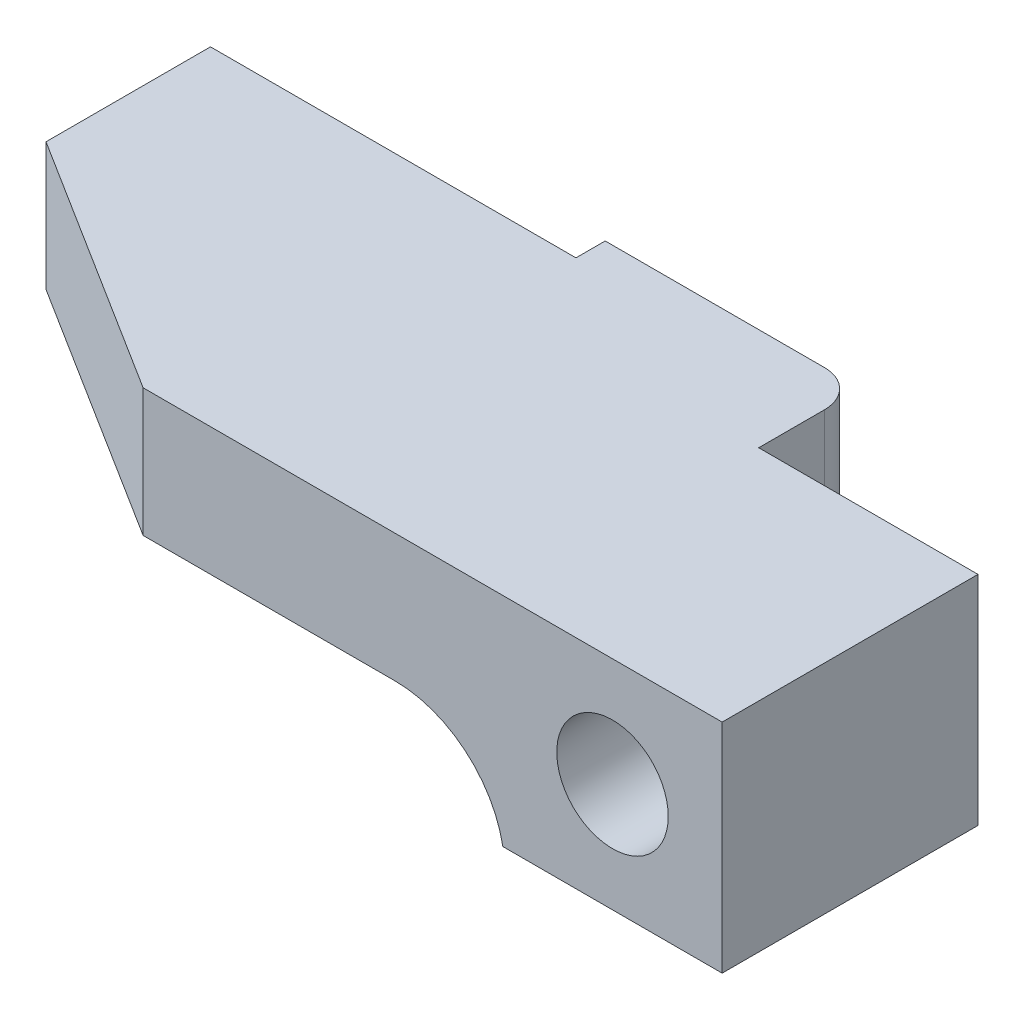
ISO-10303-21;
HEADER;
FILE_DESCRIPTION(('STEP AP214'),'2;1');
FILE_NAME('part.step','',(''),(''),'','','');
FILE_SCHEMA(('AUTOMOTIVE_DESIGN { 1 0 10303 214 1 1 1 1 }'));
ENDSEC;
DATA;
#1=APPLICATION_CONTEXT('core data for automotive mechanical design processes');
#2=APPLICATION_PROTOCOL_DEFINITION('international standard','automotive_design',2000,#1);
#3=PRODUCT_CONTEXT('',#1,'mechanical');
#4=PRODUCT('Part','Part','',(#3));
#5=PRODUCT_RELATED_PRODUCT_CATEGORY('part','',(#4));
#6=PRODUCT_DEFINITION_FORMATION('','',#4);
#7=PRODUCT_DEFINITION_CONTEXT('part definition',#1,'design');
#8=PRODUCT_DEFINITION('design','',#6,#7);
#9=PRODUCT_DEFINITION_SHAPE('','',#8);
#10=(LENGTH_UNIT() NAMED_UNIT(*) SI_UNIT(.MILLI.,.METRE.));
#11=(NAMED_UNIT(*) PLANE_ANGLE_UNIT() SI_UNIT($,.RADIAN.));
#12=(NAMED_UNIT(*) SI_UNIT($,.STERADIAN.) SOLID_ANGLE_UNIT());
#13=UNCERTAINTY_MEASURE_WITH_UNIT(LENGTH_MEASURE(1.E-05),#10,'distance_accuracy_value','');
#14=(GEOMETRIC_REPRESENTATION_CONTEXT(3) GLOBAL_UNCERTAINTY_ASSIGNED_CONTEXT((#13)) GLOBAL_UNIT_ASSIGNED_CONTEXT((#10,
#11,#12)) REPRESENTATION_CONTEXT('',''));
#15=CARTESIAN_POINT('',(0.,0.,0.));
#16=DIRECTION('',(0.,0.,1.));
#17=DIRECTION('',(1.,0.,0.));
#18=AXIS2_PLACEMENT_3D('',#15,#16,#17);
#19=CARTESIAN_POINT('',(0.,3.5,0.));
#20=DIRECTION('',(-1.,0.,0.));
#21=DIRECTION('',(0.,0.,1.));
#22=AXIS2_PLACEMENT_3D('',#19,#20,#21);
#23=PLANE('',#22);
#24=DIRECTION('',(0.,-1.,0.));
#25=VECTOR('',#24,1.);
#26=CARTESIAN_POINT('',(0.,3.5,-7.));
#27=LINE('',#26,#25);
#28=CARTESIAN_POINT('',(0.,3.5,-7.));
#29=VERTEX_POINT('',#28);
#30=CARTESIAN_POINT('',(0.,-2.45,-7.));
#31=VERTEX_POINT('',#30);
#32=EDGE_CURVE('E128',#29,#31,#27,.T.);
#33=ORIENTED_EDGE('',*,*,#32,.F.);
#34=DIRECTION('',(0.,0.,-1.));
#35=VECTOR('',#34,1.);
#36=CARTESIAN_POINT('',(0.,3.5,0.));
#37=LINE('',#36,#35);
#38=CARTESIAN_POINT('',(0.,3.5,0.));
#39=VERTEX_POINT('',#38);
#40=EDGE_CURVE('E201',#39,#29,#37,.T.);
#41=ORIENTED_EDGE('',*,*,#40,.F.);
#42=DIRECTION('',(0.,-1.,0.));
#43=VECTOR('',#42,1.);
#44=CARTESIAN_POINT('',(0.,3.5,0.));
#45=LINE('',#44,#43);
#46=CARTESIAN_POINT('',(0.,-2.45,0.));
#47=VERTEX_POINT('',#46);
#48=EDGE_CURVE('E194',#39,#47,#45,.T.);
#49=ORIENTED_EDGE('',*,*,#48,.T.);
#50=DIRECTION('',(0.,0.,-1.));
#51=VECTOR('',#50,1.);
#52=CARTESIAN_POINT('',(0.,-2.45,0.));
#53=LINE('',#52,#51);
#54=EDGE_CURVE('E144',#47,#31,#53,.T.);
#55=ORIENTED_EDGE('',*,*,#54,.T.);
#56=EDGE_LOOP('',(#33,#41,#49,#55));
#57=FACE_BOUND('',#56,.T.);
#58=ADVANCED_FACE('F39',(#57),#23,.F.);
#59=CARTESIAN_POINT('',(0.,3.5,0.));
#60=DIRECTION('',(0.,1.,0.));
#61=DIRECTION('',(0.,0.,1.));
#62=AXIS2_PLACEMENT_3D('',#59,#60,#61);
#63=PLANE('',#62);
#64=DIRECTION('',(0.,0.,-1.));
#65=VECTOR('',#64,1.);
#66=CARTESIAN_POINT('',(-6.,3.5,-9.8));
#67=LINE('',#66,#65);
#68=CARTESIAN_POINT('',(-6.,3.5,-7.));
#69=VERTEX_POINT('',#68);
#70=CARTESIAN_POINT('',(-6.,3.5,-8.8));
#71=VERTEX_POINT('',#70);
#72=EDGE_CURVE('E239',#69,#71,#67,.T.);
#73=ORIENTED_EDGE('',*,*,#72,.T.);
#74=CARTESIAN_POINT('',(-7.,3.5,-8.8));
#75=DIRECTION('',(0.,1.,0.));
#76=DIRECTION('',(0.,0.,1.));
#77=AXIS2_PLACEMENT_3D('',#74,#75,#76);
#78=CIRCLE('',#77,1.);
#79=CARTESIAN_POINT('',(-7.,3.5,-9.8));
#80=VERTEX_POINT('',#79);
#81=EDGE_CURVE('E155',#71,#80,#78,.T.);
#82=ORIENTED_EDGE('',*,*,#81,.T.);
#83=DIRECTION('',(-1.,0.,0.));
#84=VECTOR('',#83,1.);
#85=CARTESIAN_POINT('',(-13.,3.5,-9.8));
#86=LINE('',#85,#84);
#87=CARTESIAN_POINT('',(-13.,3.5,-9.8));
#88=VERTEX_POINT('',#87);
#89=EDGE_CURVE('E236',#80,#88,#86,.T.);
#90=ORIENTED_EDGE('',*,*,#89,.T.);
#91=DIRECTION('',(0.,0.,1.));
#92=VECTOR('',#91,1.);
#93=CARTESIAN_POINT('',(-13.,3.5,-9.));
#94=LINE('',#93,#92);
#95=CARTESIAN_POINT('',(-13.,3.5,-9.));
#96=VERTEX_POINT('',#95);
#97=EDGE_CURVE('E233',#88,#96,#94,.T.);
#98=ORIENTED_EDGE('',*,*,#97,.T.);
#99=DIRECTION('',(-1.,0.,0.));
#100=VECTOR('',#99,1.);
#101=CARTESIAN_POINT('',(-13.,3.5,-9.));
#102=LINE('',#101,#100);
#103=CARTESIAN_POINT('',(-23.,3.5,-9.));
#104=VERTEX_POINT('',#103);
#105=EDGE_CURVE('E230',#96,#104,#102,.T.);
#106=ORIENTED_EDGE('',*,*,#105,.T.);
#107=DIRECTION('',(0.,0.,1.));
#108=VECTOR('',#107,1.);
#109=CARTESIAN_POINT('',(-23.,3.5,-9.));
#110=LINE('',#109,#108);
#111=CARTESIAN_POINT('',(-23.,3.5,-4.5));
#112=VERTEX_POINT('',#111);
#113=EDGE_CURVE('E227',#104,#112,#110,.T.);
#114=ORIENTED_EDGE('',*,*,#113,.T.);
#115=DIRECTION('',(0.846578536173501,0.,0.532263827523844));
#116=VECTOR('',#115,1.);
#117=CARTESIAN_POINT('',(-15.8426407811639,3.5,0.));
#118=LINE('',#117,#116);
#119=CARTESIAN_POINT('',(-15.8426407811639,3.5,0.));
#120=VERTEX_POINT('',#119);
#121=EDGE_CURVE('E224',#112,#120,#118,.T.);
#122=ORIENTED_EDGE('',*,*,#121,.T.);
#123=DIRECTION('',(1.,0.,0.));
#124=VECTOR('',#123,1.);
#125=CARTESIAN_POINT('',(-15.8426407811639,3.5,0.));
#126=LINE('',#125,#124);
#127=EDGE_CURVE('E197',#120,#39,#126,.T.);
#128=ORIENTED_EDGE('',*,*,#127,.T.);
#129=ORIENTED_EDGE('',*,*,#40,.T.);
#130=DIRECTION('',(1.,0.,0.));
#131=VECTOR('',#130,1.);
#132=CARTESIAN_POINT('',(0.,3.5,-7.));
#133=LINE('',#132,#131);
#134=EDGE_CURVE('E133',#69,#29,#133,.T.);
#135=ORIENTED_EDGE('',*,*,#134,.F.);
#136=EDGE_LOOP('',(#73,#82,#90,#98,#106,#114,#122,#128,#129,#135));
#137=FACE_BOUND('',#136,.T.);
#138=ADVANCED_FACE('F303',(#137),#63,.T.);
#139=CARTESIAN_POINT('',(0.,-2.45,0.));
#140=DIRECTION('',(0.,1.,0.));
#141=DIRECTION('',(0.,0.,1.));
#142=AXIS2_PLACEMENT_3D('',#139,#140,#141);
#143=PLANE('',#142);
#144=DIRECTION('',(1.,0.,0.));
#145=VECTOR('',#144,1.);
#146=CARTESIAN_POINT('',(0.,-2.45,-7.));
#147=LINE('',#146,#145);
#148=CARTESIAN_POINT('',(-6.,-2.45,-7.));
#149=VERTEX_POINT('',#148);
#150=EDGE_CURVE('E124',#149,#31,#147,.T.);
#151=ORIENTED_EDGE('',*,*,#150,.T.);
#152=ORIENTED_EDGE('',*,*,#54,.F.);
#153=DIRECTION('',(1.,0.,0.));
#154=VECTOR('',#153,1.);
#155=CARTESIAN_POINT('',(-6.,-2.45,0.));
#156=LINE('',#155,#154);
#157=CARTESIAN_POINT('',(-6.,-2.45,0.));
#158=VERTEX_POINT('',#157);
#159=EDGE_CURVE('E141',#158,#47,#156,.T.);
#160=ORIENTED_EDGE('',*,*,#159,.F.);
#161=DIRECTION('',(0.,0.,1.));
#162=VECTOR('',#161,1.);
#163=CARTESIAN_POINT('',(-6.,-2.45,-9.));
#164=LINE('',#163,#162);
#165=EDGE_CURVE('E138',#149,#158,#164,.T.);
#166=ORIENTED_EDGE('',*,*,#165,.F.);
#167=EDGE_LOOP('',(#151,#152,#160,#166));
#168=FACE_BOUND('',#167,.T.);
#169=ADVANCED_FACE('F139',(#168),#143,.F.);
#170=CARTESIAN_POINT('',(-6.,3.5,-9.8));
#171=DIRECTION('',(-1.,0.,0.));
#172=DIRECTION('',(0.,0.,1.));
#173=AXIS2_PLACEMENT_3D('',#170,#171,#172);
#174=PLANE('',#173);
#175=DIRECTION('',(0.,0.,-1.));
#176=VECTOR('',#175,1.);
#177=CARTESIAN_POINT('',(-6.,0.,-9.8));
#178=LINE('',#177,#176);
#179=CARTESIAN_POINT('',(-6.,0.,-7.));
#180=VERTEX_POINT('',#179);
#181=CARTESIAN_POINT('',(-6.,0.,-8.8));
#182=VERTEX_POINT('',#181);
#183=EDGE_CURVE('E218',#180,#182,#178,.T.);
#184=ORIENTED_EDGE('',*,*,#183,.T.);
#185=DIRECTION('',(0.,-1.,0.));
#186=VECTOR('',#185,1.);
#187=CARTESIAN_POINT('',(-6.,3.5,-8.8));
#188=LINE('',#187,#186);
#189=EDGE_CURVE('E160',#182,#71,#188,.F.);
#190=ORIENTED_EDGE('',*,*,#189,.T.);
#191=ORIENTED_EDGE('',*,*,#72,.F.);
#192=DIRECTION('',(0.,-1.,0.));
#193=VECTOR('',#192,1.);
#194=CARTESIAN_POINT('',(-6.,3.5,-7.));
#195=LINE('',#194,#193);
#196=EDGE_CURVE('E250',#69,#180,#195,.T.);
#197=ORIENTED_EDGE('',*,*,#196,.T.);
#198=EDGE_LOOP('',(#184,#190,#191,#197));
#199=FACE_BOUND('',#198,.T.);
#200=ADVANCED_FACE('F299',(#199),#174,.F.);
#201=CARTESIAN_POINT('',(-13.,3.5,-9.8));
#202=DIRECTION('',(0.,0.,1.));
#203=DIRECTION('',(1.,0.,0.));
#204=AXIS2_PLACEMENT_3D('',#201,#202,#203);
#205=PLANE('',#204);
#206=ORIENTED_EDGE('',*,*,#89,.F.);
#207=DIRECTION('',(0.,-1.,0.));
#208=VECTOR('',#207,1.);
#209=CARTESIAN_POINT('',(-7.,3.5,-9.8));
#210=LINE('',#209,#208);
#211=CARTESIAN_POINT('',(-7.,0.,-9.8));
#212=VERTEX_POINT('',#211);
#213=EDGE_CURVE('E166',#80,#212,#210,.T.);
#214=ORIENTED_EDGE('',*,*,#213,.T.);
#215=DIRECTION('',(-1.,0.,0.));
#216=VECTOR('',#215,1.);
#217=CARTESIAN_POINT('',(-13.,0.,-9.8));
#218=LINE('',#217,#216);
#219=CARTESIAN_POINT('',(-13.,0.,-9.8));
#220=VERTEX_POINT('',#219);
#221=EDGE_CURVE('E215',#212,#220,#218,.T.);
#222=ORIENTED_EDGE('',*,*,#221,.T.);
#223=DIRECTION('',(0.,-1.,0.));
#224=VECTOR('',#223,1.);
#225=CARTESIAN_POINT('',(-13.,3.5,-9.8));
#226=LINE('',#225,#224);
#227=EDGE_CURVE('E170',#88,#220,#226,.T.);
#228=ORIENTED_EDGE('',*,*,#227,.F.);
#229=EDGE_LOOP('',(#206,#214,#222,#228));
#230=FACE_BOUND('',#229,.T.);
#231=ADVANCED_FACE('F294',(#230),#205,.F.);
#232=CARTESIAN_POINT('',(-13.,3.5,-9.));
#233=DIRECTION('',(1.,0.,0.));
#234=DIRECTION('',(0.,0.,-1.));
#235=AXIS2_PLACEMENT_3D('',#232,#233,#234);
#236=PLANE('',#235);
#237=DIRECTION('',(0.,0.,1.));
#238=VECTOR('',#237,1.);
#239=CARTESIAN_POINT('',(-13.,0.,-9.));
#240=LINE('',#239,#238);
#241=CARTESIAN_POINT('',(-13.,0.,-9.));
#242=VERTEX_POINT('',#241);
#243=EDGE_CURVE('E212',#220,#242,#240,.T.);
#244=ORIENTED_EDGE('',*,*,#243,.T.);
#245=DIRECTION('',(0.,-1.,0.));
#246=VECTOR('',#245,1.);
#247=CARTESIAN_POINT('',(-13.,3.5,-9.));
#248=LINE('',#247,#246);
#249=EDGE_CURVE('E178',#96,#242,#248,.T.);
#250=ORIENTED_EDGE('',*,*,#249,.F.);
#251=ORIENTED_EDGE('',*,*,#97,.F.);
#252=ORIENTED_EDGE('',*,*,#227,.T.);
#253=EDGE_LOOP('',(#244,#250,#251,#252));
#254=FACE_BOUND('',#253,.T.);
#255=ADVANCED_FACE('F290',(#254),#236,.F.);
#256=CARTESIAN_POINT('',(-13.,3.5,-9.));
#257=DIRECTION('',(0.,0.,1.));
#258=DIRECTION('',(1.,0.,0.));
#259=AXIS2_PLACEMENT_3D('',#256,#257,#258);
#260=PLANE('',#259);
#261=DIRECTION('',(-1.,0.,0.));
#262=VECTOR('',#261,1.);
#263=CARTESIAN_POINT('',(-13.,0.,-9.));
#264=LINE('',#263,#262);
#265=CARTESIAN_POINT('',(-23.,0.,-9.));
#266=VERTEX_POINT('',#265);
#267=EDGE_CURVE('E209',#242,#266,#264,.T.);
#268=ORIENTED_EDGE('',*,*,#267,.T.);
#269=DIRECTION('',(0.,-1.,0.));
#270=VECTOR('',#269,1.);
#271=CARTESIAN_POINT('',(-23.,3.5,-9.));
#272=LINE('',#271,#270);
#273=EDGE_CURVE('E182',#104,#266,#272,.T.);
#274=ORIENTED_EDGE('',*,*,#273,.F.);
#275=ORIENTED_EDGE('',*,*,#105,.F.);
#276=ORIENTED_EDGE('',*,*,#249,.T.);
#277=EDGE_LOOP('',(#268,#274,#275,#276));
#278=FACE_BOUND('',#277,.T.);
#279=ADVANCED_FACE('F285',(#278),#260,.F.);
#280=CARTESIAN_POINT('',(-23.,3.5,-9.));
#281=DIRECTION('',(1.,0.,0.));
#282=DIRECTION('',(0.,0.,-1.));
#283=AXIS2_PLACEMENT_3D('',#280,#281,#282);
#284=PLANE('',#283);
#285=DIRECTION('',(0.,0.,1.));
#286=VECTOR('',#285,1.);
#287=CARTESIAN_POINT('',(-23.,0.,-9.));
#288=LINE('',#287,#286);
#289=CARTESIAN_POINT('',(-23.,0.,-4.5));
#290=VERTEX_POINT('',#289);
#291=EDGE_CURVE('E206',#266,#290,#288,.T.);
#292=ORIENTED_EDGE('',*,*,#291,.T.);
#293=DIRECTION('',(0.,-1.,0.));
#294=VECTOR('',#293,1.);
#295=CARTESIAN_POINT('',(-23.,3.5,-4.5));
#296=LINE('',#295,#294);
#297=EDGE_CURVE('E186',#112,#290,#296,.T.);
#298=ORIENTED_EDGE('',*,*,#297,.F.);
#299=ORIENTED_EDGE('',*,*,#113,.F.);
#300=ORIENTED_EDGE('',*,*,#273,.T.);
#301=EDGE_LOOP('',(#292,#298,#299,#300));
#302=FACE_BOUND('',#301,.T.);
#303=ADVANCED_FACE('F279',(#302),#284,.F.);
#304=CARTESIAN_POINT('',(-15.8426407811639,3.5,0.));
#305=DIRECTION('',(0.532263827523844,0.,-0.846578536173501));
#306=DIRECTION('',(-0.846578536173501,0.,-0.532263827523844));
#307=AXIS2_PLACEMENT_3D('',#304,#305,#306);
#308=PLANE('',#307);
#309=DIRECTION('',(0.846578536173501,0.,0.532263827523844));
#310=VECTOR('',#309,1.);
#311=CARTESIAN_POINT('',(-15.8426407811639,0.,0.));
#312=LINE('',#311,#310);
#313=CARTESIAN_POINT('',(-15.8426407811639,0.,0.));
#314=VERTEX_POINT('',#313);
#315=EDGE_CURVE('E202',#290,#314,#312,.T.);
#316=ORIENTED_EDGE('',*,*,#315,.T.);
#317=DIRECTION('',(0.,-1.,0.));
#318=VECTOR('',#317,1.);
#319=CARTESIAN_POINT('',(-15.8426407811639,3.5,0.));
#320=LINE('',#319,#318);
#321=EDGE_CURVE('E190',#120,#314,#320,.T.);
#322=ORIENTED_EDGE('',*,*,#321,.F.);
#323=ORIENTED_EDGE('',*,*,#121,.F.);
#324=ORIENTED_EDGE('',*,*,#297,.T.);
#325=EDGE_LOOP('',(#316,#322,#323,#324));
#326=FACE_BOUND('',#325,.T.);
#327=ADVANCED_FACE('F268',(#326),#308,.F.);
#328=CARTESIAN_POINT('',(0.,3.5,0.));
#329=DIRECTION('',(0.,0.,-1.));
#330=DIRECTION('',(-1.,0.,0.));
#331=AXIS2_PLACEMENT_3D('',#328,#329,#330);
#332=PLANE('',#331);
#333=CARTESIAN_POINT('',(-3.,0.525,0.));
#334=DIRECTION('',(0.,0.,1.));
#335=DIRECTION('',(1.,0.,0.));
#336=AXIS2_PLACEMENT_3D('',#333,#334,#335);
#337=CIRCLE('',#336,1.525);
#338=CARTESIAN_POINT('',(-1.475,0.525,0.));
#339=VERTEX_POINT('',#338);
#340=EDGE_CURVE('E174',#339,#339,#337,.T.);
#341=ORIENTED_EDGE('',*,*,#340,.F.);
#342=EDGE_LOOP('',(#341));
#343=FACE_BOUND('',#342,.T.);
#344=DIRECTION('',(1.,0.,0.));
#345=VECTOR('',#344,1.);
#346=CARTESIAN_POINT('',(0.,0.,0.));
#347=LINE('',#346,#345);
#348=CARTESIAN_POINT('',(-8.94915242061173,0.,0.));
#349=VERTEX_POINT('',#348);
#350=EDGE_CURVE('E198',#314,#349,#347,.T.);
#351=ORIENTED_EDGE('',*,*,#350,.T.);
#352=CARTESIAN_POINT('',(-8.94915242061173,-3.,0.));
#353=DIRECTION('',(0.,0.,-1.));
#354=DIRECTION('',(-1.,0.,0.));
#355=AXIS2_PLACEMENT_3D('',#352,#353,#354);
#356=CIRCLE('',#355,3.);
#357=EDGE_CURVE('E48',#349,#158,#356,.T.);
#358=ORIENTED_EDGE('',*,*,#357,.T.);
#359=ORIENTED_EDGE('',*,*,#159,.T.);
#360=ORIENTED_EDGE('',*,*,#48,.F.);
#361=ORIENTED_EDGE('',*,*,#127,.F.);
#362=ORIENTED_EDGE('',*,*,#321,.T.);
#363=EDGE_LOOP('',(#351,#358,#359,#360,#361,#362));
#364=FACE_BOUND('',#363,.T.);
#365=ADVANCED_FACE('F264',(#343,#364),#332,.F.);
#366=CARTESIAN_POINT('',(0.,0.,0.));
#367=DIRECTION('',(0.,1.,0.));
#368=DIRECTION('',(0.,0.,1.));
#369=AXIS2_PLACEMENT_3D('',#366,#367,#368);
#370=PLANE('',#369);
#371=DIRECTION('',(-1.,0.,0.));
#372=VECTOR('',#371,1.);
#373=CARTESIAN_POINT('',(0.,0.,-7.));
#374=LINE('',#373,#372);
#375=CARTESIAN_POINT('',(-8.94915242061173,0.,-7.));
#376=VERTEX_POINT('',#375);
#377=EDGE_CURVE('E54',#180,#376,#374,.T.);
#378=ORIENTED_EDGE('',*,*,#377,.T.);
#379=DIRECTION('',(0.,0.,-1.));
#380=VECTOR('',#379,1.);
#381=CARTESIAN_POINT('',(-8.94915242061173,0.,0.));
#382=LINE('',#381,#380);
#383=EDGE_CURVE('E148',#376,#349,#382,.F.);
#384=ORIENTED_EDGE('',*,*,#383,.T.);
#385=ORIENTED_EDGE('',*,*,#350,.F.);
#386=ORIENTED_EDGE('',*,*,#315,.F.);
#387=ORIENTED_EDGE('',*,*,#291,.F.);
#388=ORIENTED_EDGE('',*,*,#267,.F.);
#389=ORIENTED_EDGE('',*,*,#243,.F.);
#390=ORIENTED_EDGE('',*,*,#221,.F.);
#391=CARTESIAN_POINT('',(-7.,0.,-8.8));
#392=DIRECTION('',(0.,1.,0.));
#393=DIRECTION('',(0.,0.,1.));
#394=AXIS2_PLACEMENT_3D('',#391,#392,#393);
#395=CIRCLE('',#394,1.);
#396=EDGE_CURVE('E163',#212,#182,#395,.F.);
#397=ORIENTED_EDGE('',*,*,#396,.T.);
#398=ORIENTED_EDGE('',*,*,#183,.F.);
#399=EDGE_LOOP('',(#378,#384,#385,#386,#387,#388,#389,#390,#397,#398));
#400=FACE_BOUND('',#399,.T.);
#401=ADVANCED_FACE('F267',(#400),#370,.F.);
#402=CARTESIAN_POINT('',(0.,3.5,-7.));
#403=DIRECTION('',(0.,0.,-1.));
#404=DIRECTION('',(-1.,0.,0.));
#405=AXIS2_PLACEMENT_3D('',#402,#403,#404);
#406=PLANE('',#405);
#407=CARTESIAN_POINT('',(-3.,0.525,-7.));
#408=DIRECTION('',(0.,0.,-1.));
#409=DIRECTION('',(-1.,0.,0.));
#410=AXIS2_PLACEMENT_3D('',#407,#408,#409);
#411=CIRCLE('',#410,1.525);
#412=CARTESIAN_POINT('',(-4.525,0.525,-7.));
#413=VERTEX_POINT('',#412);
#414=EDGE_CURVE('E134',#413,#413,#411,.T.);
#415=ORIENTED_EDGE('',*,*,#414,.F.);
#416=EDGE_LOOP('',(#415));
#417=FACE_BOUND('',#416,.T.);
#418=ORIENTED_EDGE('',*,*,#196,.F.);
#419=ORIENTED_EDGE('',*,*,#134,.T.);
#420=ORIENTED_EDGE('',*,*,#32,.T.);
#421=ORIENTED_EDGE('',*,*,#150,.F.);
#422=CARTESIAN_POINT('',(-8.94915242061173,-3.,-7.));
#423=DIRECTION('',(0.,0.,-1.));
#424=DIRECTION('',(-1.,0.,0.));
#425=AXIS2_PLACEMENT_3D('',#422,#423,#424);
#426=CIRCLE('',#425,3.);
#427=EDGE_CURVE('E11',#149,#376,#426,.F.);
#428=ORIENTED_EDGE('',*,*,#427,.T.);
#429=ORIENTED_EDGE('',*,*,#377,.F.);
#430=EDGE_LOOP('',(#418,#419,#420,#421,#428,#429));
#431=FACE_BOUND('',#430,.T.);
#432=ADVANCED_FACE('F126',(#417,#431),#406,.T.);
#433=CARTESIAN_POINT('',(-3.,0.525,-9.8));
#434=DIRECTION('',(0.,0.,1.));
#435=DIRECTION('',(1.,0.,0.));
#436=AXIS2_PLACEMENT_3D('',#433,#434,#435);
#437=CYLINDRICAL_SURFACE('',#436,1.525);
#438=ORIENTED_EDGE('',*,*,#414,.T.);
#439=EDGE_LOOP('',(#438));
#440=FACE_BOUND('',#439,.T.);
#441=ORIENTED_EDGE('',*,*,#340,.T.);
#442=EDGE_LOOP('',(#441));
#443=FACE_BOUND('',#442,.T.);
#444=ADVANCED_FACE('F262',(#440,#443),#437,.F.);
#445=CARTESIAN_POINT('',(-7.,3.5,-8.8));
#446=DIRECTION('',(0.,-1.,0.));
#447=DIRECTION('',(0.,0.,-1.));
#448=AXIS2_PLACEMENT_3D('',#445,#446,#447);
#449=CYLINDRICAL_SURFACE('',#448,1.);
#450=ORIENTED_EDGE('',*,*,#81,.F.);
#451=ORIENTED_EDGE('',*,*,#189,.F.);
#452=ORIENTED_EDGE('',*,*,#396,.F.);
#453=ORIENTED_EDGE('',*,*,#213,.F.);
#454=EDGE_LOOP('',(#450,#451,#452,#453));
#455=FACE_BOUND('',#454,.T.);
#456=ADVANCED_FACE('F301',(#455),#449,.T.);
#457=CARTESIAN_POINT('',(-8.94915242061173,-3.,-9.));
#458=DIRECTION('',(0.,0.,-1.));
#459=DIRECTION('',(-1.,0.,0.));
#460=AXIS2_PLACEMENT_3D('',#457,#458,#459);
#461=CYLINDRICAL_SURFACE('',#460,3.);
#462=ORIENTED_EDGE('',*,*,#427,.F.);
#463=ORIENTED_EDGE('',*,*,#165,.T.);
#464=ORIENTED_EDGE('',*,*,#357,.F.);
#465=ORIENTED_EDGE('',*,*,#383,.F.);
#466=EDGE_LOOP('',(#462,#463,#464,#465));
#467=FACE_BOUND('',#466,.T.);
#468=ADVANCED_FACE('F41',(#467),#461,.F.);
#469=CLOSED_SHELL('',(#58,#138,#169,#200,#231,#255,#279,#303,#327,#365,#401,#432,#444,#456,#468));
#470=MANIFOLD_SOLID_BREP('B2',#469);
#471=ADVANCED_BREP_SHAPE_REPRESENTATION('',(#18,#470),#14);
#472=SHAPE_DEFINITION_REPRESENTATION(#9,#471);
ENDSEC;
END-ISO-10303-21;
